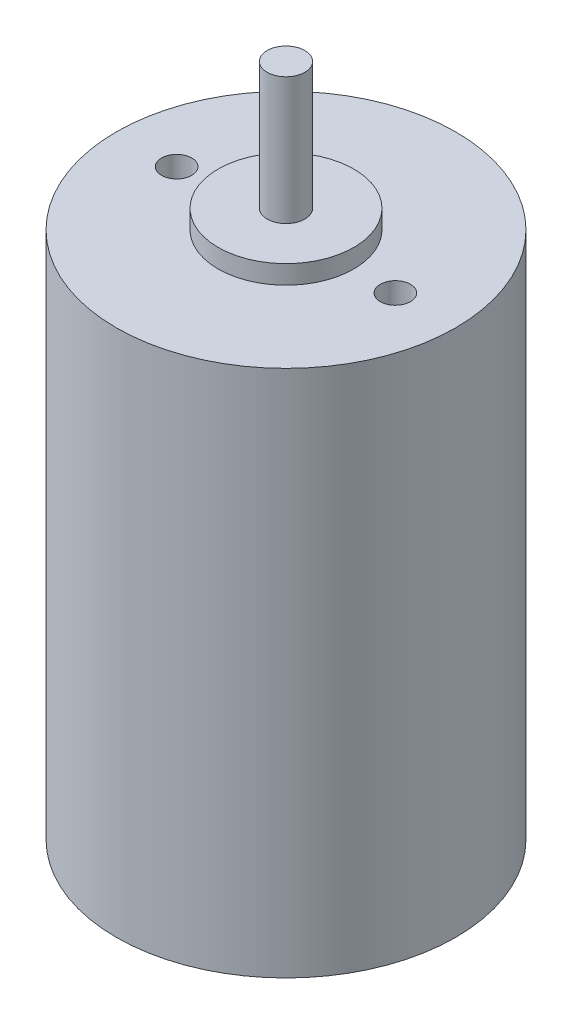
ISO-10303-21;
HEADER;
FILE_DESCRIPTION(('STEP AP214'),'2;1');
FILE_NAME('part.step','',(''),(''),'','','');
FILE_SCHEMA(('AUTOMOTIVE_DESIGN { 1 0 10303 214 1 1 1 1 }'));
ENDSEC;
DATA;
#1=APPLICATION_CONTEXT('core data for automotive mechanical design processes');
#2=APPLICATION_PROTOCOL_DEFINITION('international standard','automotive_design',2000,#1);
#3=PRODUCT_CONTEXT('',#1,'mechanical');
#4=PRODUCT('Part','Part','',(#3));
#5=PRODUCT_RELATED_PRODUCT_CATEGORY('part','',(#4));
#6=PRODUCT_DEFINITION_FORMATION('','',#4);
#7=PRODUCT_DEFINITION_CONTEXT('part definition',#1,'design');
#8=PRODUCT_DEFINITION('design','',#6,#7);
#9=PRODUCT_DEFINITION_SHAPE('','',#8);
#10=(LENGTH_UNIT() NAMED_UNIT(*) SI_UNIT(.MILLI.,.METRE.));
#11=(NAMED_UNIT(*) PLANE_ANGLE_UNIT() SI_UNIT($,.RADIAN.));
#12=(NAMED_UNIT(*) SI_UNIT($,.STERADIAN.) SOLID_ANGLE_UNIT());
#13=UNCERTAINTY_MEASURE_WITH_UNIT(LENGTH_MEASURE(1.E-05),#10,'distance_accuracy_value','');
#14=(GEOMETRIC_REPRESENTATION_CONTEXT(3) GLOBAL_UNCERTAINTY_ASSIGNED_CONTEXT((#13)) GLOBAL_UNIT_ASSIGNED_CONTEXT((#10,
#11,#12)) REPRESENTATION_CONTEXT('',''));
#15=CARTESIAN_POINT('',(0.,0.,0.));
#16=DIRECTION('',(0.,0.,1.));
#17=DIRECTION('',(1.,0.,0.));
#18=AXIS2_PLACEMENT_3D('',#15,#16,#17);
#19=CARTESIAN_POINT('',(0.,70.,0.));
#20=DIRECTION('',(0.,-1.,0.));
#21=DIRECTION('',(0.,0.,-1.));
#22=AXIS2_PLACEMENT_3D('',#19,#20,#21);
#23=CYLINDRICAL_SURFACE('',#22,22.5);
#24=CARTESIAN_POINT('',(0.,70.,0.));
#25=DIRECTION('',(0.,1.,0.));
#26=DIRECTION('',(0.,0.,1.));
#27=AXIS2_PLACEMENT_3D('',#24,#25,#26);
#28=CIRCLE('',#27,22.5);
#29=CARTESIAN_POINT('',(0.,70.,22.5));
#30=VERTEX_POINT('',#29);
#31=EDGE_CURVE('E10',#30,#30,#28,.T.);
#32=ORIENTED_EDGE('',*,*,#31,.F.);
#33=EDGE_LOOP('',(#32));
#34=FACE_BOUND('',#33,.T.);
#35=CARTESIAN_POINT('',(0.,0.,0.));
#36=DIRECTION('',(0.,1.,0.));
#37=DIRECTION('',(0.,0.,1.));
#38=AXIS2_PLACEMENT_3D('',#35,#36,#37);
#39=CIRCLE('',#38,22.5);
#40=CARTESIAN_POINT('',(0.,0.,22.5));
#41=VERTEX_POINT('',#40);
#42=EDGE_CURVE('E34',#41,#41,#39,.T.);
#43=ORIENTED_EDGE('',*,*,#42,.T.);
#44=EDGE_LOOP('',(#43));
#45=FACE_BOUND('',#44,.T.);
#46=ADVANCED_FACE('F31',(#34,#45),#23,.T.);
#47=CARTESIAN_POINT('',(0.,70.,0.));
#48=DIRECTION('',(0.,1.,0.));
#49=DIRECTION('',(0.,0.,1.));
#50=AXIS2_PLACEMENT_3D('',#47,#48,#49);
#51=PLANE('',#50);
#52=CARTESIAN_POINT('',(14.5,70.,0.));
#53=DIRECTION('',(0.,1.,0.));
#54=DIRECTION('',(0.,0.,1.));
#55=AXIS2_PLACEMENT_3D('',#52,#53,#54);
#56=CIRCLE('',#55,2.);
#57=CARTESIAN_POINT('',(14.5,70.,2.));
#58=VERTEX_POINT('',#57);
#59=EDGE_CURVE('E61',#58,#58,#56,.T.);
#60=ORIENTED_EDGE('',*,*,#59,.F.);
#61=EDGE_LOOP('',(#60));
#62=FACE_BOUND('',#61,.T.);
#63=CARTESIAN_POINT('',(-14.5,70.,0.));
#64=DIRECTION('',(0.,1.,0.));
#65=DIRECTION('',(0.,0.,1.));
#66=AXIS2_PLACEMENT_3D('',#63,#64,#65);
#67=CIRCLE('',#66,2.);
#68=CARTESIAN_POINT('',(-14.5,70.,2.));
#69=VERTEX_POINT('',#68);
#70=EDGE_CURVE('E55',#69,#69,#67,.T.);
#71=ORIENTED_EDGE('',*,*,#70,.F.);
#72=EDGE_LOOP('',(#71));
#73=FACE_BOUND('',#72,.T.);
#74=CARTESIAN_POINT('',(0.,70.,0.));
#75=DIRECTION('',(0.,1.,0.));
#76=DIRECTION('',(0.,0.,1.));
#77=AXIS2_PLACEMENT_3D('',#74,#75,#76);
#78=CIRCLE('',#77,9.);
#79=CARTESIAN_POINT('',(0.,70.,9.));
#80=VERTEX_POINT('',#79);
#81=EDGE_CURVE('E43',#80,#80,#78,.T.);
#82=ORIENTED_EDGE('',*,*,#81,.F.);
#83=EDGE_LOOP('',(#82));
#84=FACE_BOUND('',#83,.T.);
#85=ORIENTED_EDGE('',*,*,#31,.T.);
#86=EDGE_LOOP('',(#85));
#87=FACE_BOUND('',#86,.T.);
#88=ADVANCED_FACE('F76',(#62,#73,#84,#87),#51,.T.);
#89=CARTESIAN_POINT('',(0.,0.,0.));
#90=DIRECTION('',(0.,1.,0.));
#91=DIRECTION('',(0.,0.,1.));
#92=AXIS2_PLACEMENT_3D('',#89,#90,#91);
#93=PLANE('',#92);
#94=ORIENTED_EDGE('',*,*,#42,.F.);
#95=EDGE_LOOP('',(#94));
#96=FACE_BOUND('',#95,.T.);
#97=ADVANCED_FACE('F79',(#96),#93,.F.);
#98=CARTESIAN_POINT('',(0.,72.48,0.));
#99=DIRECTION('',(0.,-1.,0.));
#100=DIRECTION('',(0.,0.,-1.));
#101=AXIS2_PLACEMENT_3D('',#98,#99,#100);
#102=CYLINDRICAL_SURFACE('',#101,9.);
#103=CARTESIAN_POINT('',(0.,72.48,0.));
#104=DIRECTION('',(0.,1.,0.));
#105=DIRECTION('',(0.,0.,1.));
#106=AXIS2_PLACEMENT_3D('',#103,#104,#105);
#107=CIRCLE('',#106,9.);
#108=CARTESIAN_POINT('',(0.,72.48,9.));
#109=VERTEX_POINT('',#108);
#110=EDGE_CURVE('E41',#109,#109,#107,.T.);
#111=ORIENTED_EDGE('',*,*,#110,.F.);
#112=EDGE_LOOP('',(#111));
#113=FACE_BOUND('',#112,.T.);
#114=ORIENTED_EDGE('',*,*,#81,.T.);
#115=EDGE_LOOP('',(#114));
#116=FACE_BOUND('',#115,.T.);
#117=ADVANCED_FACE('F85',(#113,#116),#102,.T.);
#118=CARTESIAN_POINT('',(0.,72.48,0.));
#119=DIRECTION('',(0.,1.,0.));
#120=DIRECTION('',(0.,0.,1.));
#121=AXIS2_PLACEMENT_3D('',#118,#119,#120);
#122=PLANE('',#121);
#123=CARTESIAN_POINT('',(0.,72.48,0.));
#124=DIRECTION('',(0.,1.,0.));
#125=DIRECTION('',(0.,0.,1.));
#126=AXIS2_PLACEMENT_3D('',#123,#124,#125);
#127=CIRCLE('',#126,2.5);
#128=CARTESIAN_POINT('',(0.,72.48,2.5));
#129=VERTEX_POINT('',#128);
#130=EDGE_CURVE('E49',#129,#129,#127,.T.);
#131=ORIENTED_EDGE('',*,*,#130,.F.);
#132=EDGE_LOOP('',(#131));
#133=FACE_BOUND('',#132,.T.);
#134=ORIENTED_EDGE('',*,*,#110,.T.);
#135=EDGE_LOOP('',(#134));
#136=FACE_BOUND('',#135,.T.);
#137=ADVANCED_FACE('F87',(#133,#136),#122,.T.);
#138=CARTESIAN_POINT('',(0.,89.34,0.));
#139=DIRECTION('',(0.,-1.,0.));
#140=DIRECTION('',(0.,0.,-1.));
#141=AXIS2_PLACEMENT_3D('',#138,#139,#140);
#142=CYLINDRICAL_SURFACE('',#141,2.5);
#143=CARTESIAN_POINT('',(0.,89.34,0.));
#144=DIRECTION('',(0.,1.,0.));
#145=DIRECTION('',(0.,0.,1.));
#146=AXIS2_PLACEMENT_3D('',#143,#144,#145);
#147=CIRCLE('',#146,2.5);
#148=CARTESIAN_POINT('',(0.,89.34,2.5));
#149=VERTEX_POINT('',#148);
#150=EDGE_CURVE('E46',#149,#149,#147,.T.);
#151=ORIENTED_EDGE('',*,*,#150,.F.);
#152=EDGE_LOOP('',(#151));
#153=FACE_BOUND('',#152,.T.);
#154=ORIENTED_EDGE('',*,*,#130,.T.);
#155=EDGE_LOOP('',(#154));
#156=FACE_BOUND('',#155,.T.);
#157=ADVANCED_FACE('F94',(#153,#156),#142,.T.);
#158=CARTESIAN_POINT('',(0.,89.34,0.));
#159=DIRECTION('',(0.,1.,0.));
#160=DIRECTION('',(0.,0.,1.));
#161=AXIS2_PLACEMENT_3D('',#158,#159,#160);
#162=PLANE('',#161);
#163=ORIENTED_EDGE('',*,*,#150,.T.);
#164=EDGE_LOOP('',(#163));
#165=FACE_BOUND('',#164,.T.);
#166=ADVANCED_FACE('F133',(#165),#162,.T.);
#167=CARTESIAN_POINT('',(-14.5,66.,0.));
#168=DIRECTION('',(0.,1.,0.));
#169=DIRECTION('',(0.,0.,1.));
#170=AXIS2_PLACEMENT_3D('',#167,#168,#169);
#171=CYLINDRICAL_SURFACE('',#170,2.);
#172=CARTESIAN_POINT('',(-14.5,66.,0.));
#173=DIRECTION('',(0.,1.,0.));
#174=DIRECTION('',(0.,0.,1.));
#175=AXIS2_PLACEMENT_3D('',#172,#173,#174);
#176=CIRCLE('',#175,2.);
#177=CARTESIAN_POINT('',(-14.5,66.,2.));
#178=VERTEX_POINT('',#177);
#179=EDGE_CURVE('E52',#178,#178,#176,.T.);
#180=ORIENTED_EDGE('',*,*,#179,.F.);
#181=EDGE_LOOP('',(#180));
#182=FACE_BOUND('',#181,.T.);
#183=ORIENTED_EDGE('',*,*,#70,.T.);
#184=EDGE_LOOP('',(#183));
#185=FACE_BOUND('',#184,.T.);
#186=ADVANCED_FACE('F142',(#182,#185),#171,.F.);
#187=CARTESIAN_POINT('',(-14.5,66.,0.));
#188=DIRECTION('',(0.,1.,0.));
#189=DIRECTION('',(0.,0.,1.));
#190=AXIS2_PLACEMENT_3D('',#187,#188,#189);
#191=PLANE('',#190);
#192=ORIENTED_EDGE('',*,*,#179,.T.);
#193=EDGE_LOOP('',(#192));
#194=FACE_BOUND('',#193,.T.);
#195=ADVANCED_FACE('F72',(#194),#191,.T.);
#196=CARTESIAN_POINT('',(14.5,66.,0.));
#197=DIRECTION('',(0.,1.,0.));
#198=DIRECTION('',(0.,0.,1.));
#199=AXIS2_PLACEMENT_3D('',#196,#197,#198);
#200=CYLINDRICAL_SURFACE('',#199,2.);
#201=CARTESIAN_POINT('',(14.5,66.,0.));
#202=DIRECTION('',(0.,1.,0.));
#203=DIRECTION('',(0.,0.,1.));
#204=AXIS2_PLACEMENT_3D('',#201,#202,#203);
#205=CIRCLE('',#204,2.);
#206=CARTESIAN_POINT('',(14.5,66.,2.));
#207=VERTEX_POINT('',#206);
#208=EDGE_CURVE('E58',#207,#207,#205,.T.);
#209=ORIENTED_EDGE('',*,*,#208,.F.);
#210=EDGE_LOOP('',(#209));
#211=FACE_BOUND('',#210,.T.);
#212=ORIENTED_EDGE('',*,*,#59,.T.);
#213=EDGE_LOOP('',(#212));
#214=FACE_BOUND('',#213,.T.);
#215=ADVANCED_FACE('F69',(#211,#214),#200,.F.);
#216=CARTESIAN_POINT('',(14.5,66.,0.));
#217=DIRECTION('',(0.,1.,0.));
#218=DIRECTION('',(0.,0.,1.));
#219=AXIS2_PLACEMENT_3D('',#216,#217,#218);
#220=PLANE('',#219);
#221=ORIENTED_EDGE('',*,*,#208,.T.);
#222=EDGE_LOOP('',(#221));
#223=FACE_BOUND('',#222,.T.);
#224=ADVANCED_FACE('F67',(#223),#220,.T.);
#225=CLOSED_SHELL('',(#46,#88,#97,#117,#137,#157,#166,#186,#195,#215,#224));
#226=MANIFOLD_SOLID_BREP('B2',#225);
#227=ADVANCED_BREP_SHAPE_REPRESENTATION('',(#18,#226),#14);
#228=SHAPE_DEFINITION_REPRESENTATION(#9,#227);
ENDSEC;
END-ISO-10303-21;
